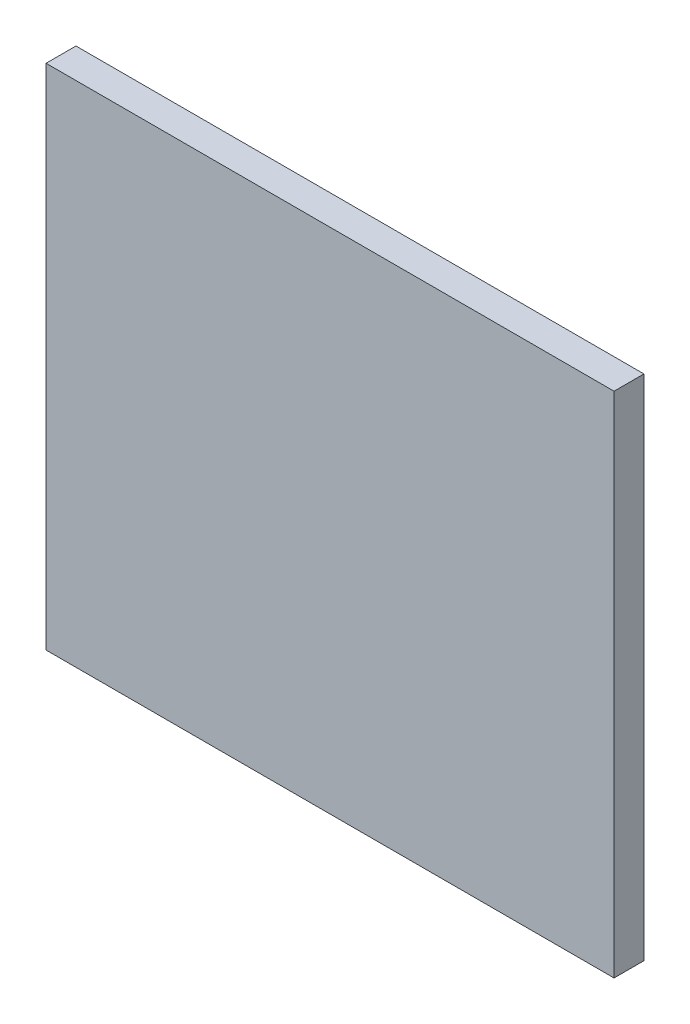
ISO-10303-21;
HEADER;
FILE_DESCRIPTION(('STEP AP214'),'2;1');
FILE_NAME('part.step','',(''),(''),'','','');
FILE_SCHEMA(('AUTOMOTIVE_DESIGN { 1 0 10303 214 1 1 1 1 }'));
ENDSEC;
DATA;
#1=APPLICATION_CONTEXT('core data for automotive mechanical design processes');
#2=APPLICATION_PROTOCOL_DEFINITION('international standard','automotive_design',2000,#1);
#3=PRODUCT_CONTEXT('',#1,'mechanical');
#4=PRODUCT('Part','Part','',(#3));
#5=PRODUCT_RELATED_PRODUCT_CATEGORY('part','',(#4));
#6=PRODUCT_DEFINITION_FORMATION('','',#4);
#7=PRODUCT_DEFINITION_CONTEXT('part definition',#1,'design');
#8=PRODUCT_DEFINITION('design','',#6,#7);
#9=PRODUCT_DEFINITION_SHAPE('','',#8);
#10=(LENGTH_UNIT() NAMED_UNIT(*) SI_UNIT(.MILLI.,.METRE.));
#11=(NAMED_UNIT(*) PLANE_ANGLE_UNIT() SI_UNIT($,.RADIAN.));
#12=(NAMED_UNIT(*) SI_UNIT($,.STERADIAN.) SOLID_ANGLE_UNIT());
#13=UNCERTAINTY_MEASURE_WITH_UNIT(LENGTH_MEASURE(1.E-05),#10,'distance_accuracy_value','');
#14=(GEOMETRIC_REPRESENTATION_CONTEXT(3) GLOBAL_UNCERTAINTY_ASSIGNED_CONTEXT((#13)) GLOBAL_UNIT_ASSIGNED_CONTEXT((#10,
#11,#12)) REPRESENTATION_CONTEXT('',''));
#15=CARTESIAN_POINT('',(0.,0.,0.));
#16=DIRECTION('',(0.,0.,1.));
#17=DIRECTION('',(1.,0.,0.));
#18=AXIS2_PLACEMENT_3D('',#15,#16,#17);
#19=CARTESIAN_POINT('',(95.,-85.,10.));
#20=DIRECTION('',(-1.,0.,0.));
#21=DIRECTION('',(0.,0.,1.));
#22=AXIS2_PLACEMENT_3D('',#19,#20,#21);
#23=PLANE('',#22);
#24=DIRECTION('',(0.,1.,0.));
#25=VECTOR('',#24,1.);
#26=CARTESIAN_POINT('',(95.,-85.,0.));
#27=LINE('',#26,#25);
#28=CARTESIAN_POINT('',(95.,-85.,0.));
#29=VERTEX_POINT('',#28);
#30=CARTESIAN_POINT('',(95.,85.,0.));
#31=VERTEX_POINT('',#30);
#32=EDGE_CURVE('E102',#29,#31,#27,.T.);
#33=ORIENTED_EDGE('',*,*,#32,.T.);
#34=DIRECTION('',(0.,0.,-1.));
#35=VECTOR('',#34,1.);
#36=CARTESIAN_POINT('',(95.,85.,10.));
#37=LINE('',#36,#35);
#38=CARTESIAN_POINT('',(95.,85.,10.));
#39=VERTEX_POINT('',#38);
#40=EDGE_CURVE('E11',#39,#31,#37,.T.);
#41=ORIENTED_EDGE('',*,*,#40,.F.);
#42=DIRECTION('',(0.,1.,0.));
#43=VECTOR('',#42,1.);
#44=CARTESIAN_POINT('',(95.,-85.,10.));
#45=LINE('',#44,#43);
#46=CARTESIAN_POINT('',(95.,-85.,10.));
#47=VERTEX_POINT('',#46);
#48=EDGE_CURVE('E90',#47,#39,#45,.T.);
#49=ORIENTED_EDGE('',*,*,#48,.F.);
#50=DIRECTION('',(0.,0.,-1.));
#51=VECTOR('',#50,1.);
#52=CARTESIAN_POINT('',(95.,-85.,10.));
#53=LINE('',#52,#51);
#54=EDGE_CURVE('E98',#47,#29,#53,.T.);
#55=ORIENTED_EDGE('',*,*,#54,.T.);
#56=EDGE_LOOP('',(#33,#41,#49,#55));
#57=FACE_BOUND('',#56,.T.);
#58=ADVANCED_FACE('F39',(#57),#23,.F.);
#59=CARTESIAN_POINT('',(-95.,85.,10.));
#60=DIRECTION('',(0.,-1.,0.));
#61=DIRECTION('',(0.,0.,-1.));
#62=AXIS2_PLACEMENT_3D('',#59,#60,#61);
#63=PLANE('',#62);
#64=DIRECTION('',(-1.,0.,0.));
#65=VECTOR('',#64,1.);
#66=CARTESIAN_POINT('',(-95.,85.,0.));
#67=LINE('',#66,#65);
#68=CARTESIAN_POINT('',(-95.,85.,0.));
#69=VERTEX_POINT('',#68);
#70=EDGE_CURVE('E94',#31,#69,#67,.T.);
#71=ORIENTED_EDGE('',*,*,#70,.T.);
#72=DIRECTION('',(0.,0.,-1.));
#73=VECTOR('',#72,1.);
#74=CARTESIAN_POINT('',(-95.,85.,10.));
#75=LINE('',#74,#73);
#76=CARTESIAN_POINT('',(-95.,85.,10.));
#77=VERTEX_POINT('',#76);
#78=EDGE_CURVE('E47',#77,#69,#75,.T.);
#79=ORIENTED_EDGE('',*,*,#78,.F.);
#80=DIRECTION('',(-1.,0.,0.));
#81=VECTOR('',#80,1.);
#82=CARTESIAN_POINT('',(-95.,85.,10.));
#83=LINE('',#82,#81);
#84=EDGE_CURVE('E85',#39,#77,#83,.T.);
#85=ORIENTED_EDGE('',*,*,#84,.F.);
#86=ORIENTED_EDGE('',*,*,#40,.T.);
#87=EDGE_LOOP('',(#71,#79,#85,#86));
#88=FACE_BOUND('',#87,.T.);
#89=ADVANCED_FACE('F93',(#88),#63,.F.);
#90=CARTESIAN_POINT('',(-95.,-85.,10.));
#91=DIRECTION('',(1.,0.,0.));
#92=DIRECTION('',(0.,0.,-1.));
#93=AXIS2_PLACEMENT_3D('',#90,#91,#92);
#94=PLANE('',#93);
#95=DIRECTION('',(0.,-1.,0.));
#96=VECTOR('',#95,1.);
#97=CARTESIAN_POINT('',(-95.,-85.,0.));
#98=LINE('',#97,#96);
#99=CARTESIAN_POINT('',(-95.,-85.,0.));
#100=VERTEX_POINT('',#99);
#101=EDGE_CURVE('E72',#69,#100,#98,.T.);
#102=ORIENTED_EDGE('',*,*,#101,.T.);
#103=DIRECTION('',(0.,0.,-1.));
#104=VECTOR('',#103,1.);
#105=CARTESIAN_POINT('',(-95.,-85.,10.));
#106=LINE('',#105,#104);
#107=CARTESIAN_POINT('',(-95.,-85.,10.));
#108=VERTEX_POINT('',#107);
#109=EDGE_CURVE('E95',#108,#100,#106,.T.);
#110=ORIENTED_EDGE('',*,*,#109,.F.);
#111=DIRECTION('',(0.,-1.,0.));
#112=VECTOR('',#111,1.);
#113=CARTESIAN_POINT('',(-95.,-85.,10.));
#114=LINE('',#113,#112);
#115=EDGE_CURVE('E88',#77,#108,#114,.T.);
#116=ORIENTED_EDGE('',*,*,#115,.F.);
#117=ORIENTED_EDGE('',*,*,#78,.T.);
#118=EDGE_LOOP('',(#102,#110,#116,#117));
#119=FACE_BOUND('',#118,.T.);
#120=ADVANCED_FACE('F96',(#119),#94,.F.);
#121=CARTESIAN_POINT('',(-95.,-85.,10.));
#122=DIRECTION('',(0.,1.,0.));
#123=DIRECTION('',(0.,0.,1.));
#124=AXIS2_PLACEMENT_3D('',#121,#122,#123);
#125=PLANE('',#124);
#126=DIRECTION('',(1.,0.,0.));
#127=VECTOR('',#126,1.);
#128=CARTESIAN_POINT('',(-95.,-85.,0.));
#129=LINE('',#128,#127);
#130=EDGE_CURVE('E78',#100,#29,#129,.T.);
#131=ORIENTED_EDGE('',*,*,#130,.T.);
#132=ORIENTED_EDGE('',*,*,#54,.F.);
#133=DIRECTION('',(1.,0.,0.));
#134=VECTOR('',#133,1.);
#135=CARTESIAN_POINT('',(-95.,-85.,10.));
#136=LINE('',#135,#134);
#137=EDGE_CURVE('E55',#108,#47,#136,.T.);
#138=ORIENTED_EDGE('',*,*,#137,.F.);
#139=ORIENTED_EDGE('',*,*,#109,.T.);
#140=EDGE_LOOP('',(#131,#132,#138,#139));
#141=FACE_BOUND('',#140,.T.);
#142=ADVANCED_FACE('F109',(#141),#125,.F.);
#143=CARTESIAN_POINT('',(0.,0.,10.));
#144=DIRECTION('',(0.,0.,-1.));
#145=DIRECTION('',(-1.,0.,0.));
#146=AXIS2_PLACEMENT_3D('',#143,#144,#145);
#147=PLANE('',#146);
#148=ORIENTED_EDGE('',*,*,#48,.T.);
#149=ORIENTED_EDGE('',*,*,#84,.T.);
#150=ORIENTED_EDGE('',*,*,#115,.T.);
#151=ORIENTED_EDGE('',*,*,#137,.T.);
#152=EDGE_LOOP('',(#148,#149,#150,#151));
#153=FACE_BOUND('',#152,.T.);
#154=ADVANCED_FACE('F86',(#153),#147,.F.);
#155=CARTESIAN_POINT('',(0.,0.,0.));
#156=DIRECTION('',(0.,0.,-1.));
#157=DIRECTION('',(-1.,0.,0.));
#158=AXIS2_PLACEMENT_3D('',#155,#156,#157);
#159=PLANE('',#158);
#160=ORIENTED_EDGE('',*,*,#32,.F.);
#161=ORIENTED_EDGE('',*,*,#130,.F.);
#162=ORIENTED_EDGE('',*,*,#101,.F.);
#163=ORIENTED_EDGE('',*,*,#70,.F.);
#164=EDGE_LOOP('',(#160,#161,#162,#163));
#165=FACE_BOUND('',#164,.T.);
#166=ADVANCED_FACE('F112',(#165),#159,.T.);
#167=CLOSED_SHELL('',(#58,#89,#120,#142,#154,#166));
#168=MANIFOLD_SOLID_BREP('B2',#167);
#169=ADVANCED_BREP_SHAPE_REPRESENTATION('',(#18,#168),#14);
#170=SHAPE_DEFINITION_REPRESENTATION(#9,#169);
ENDSEC;
END-ISO-10303-21;
